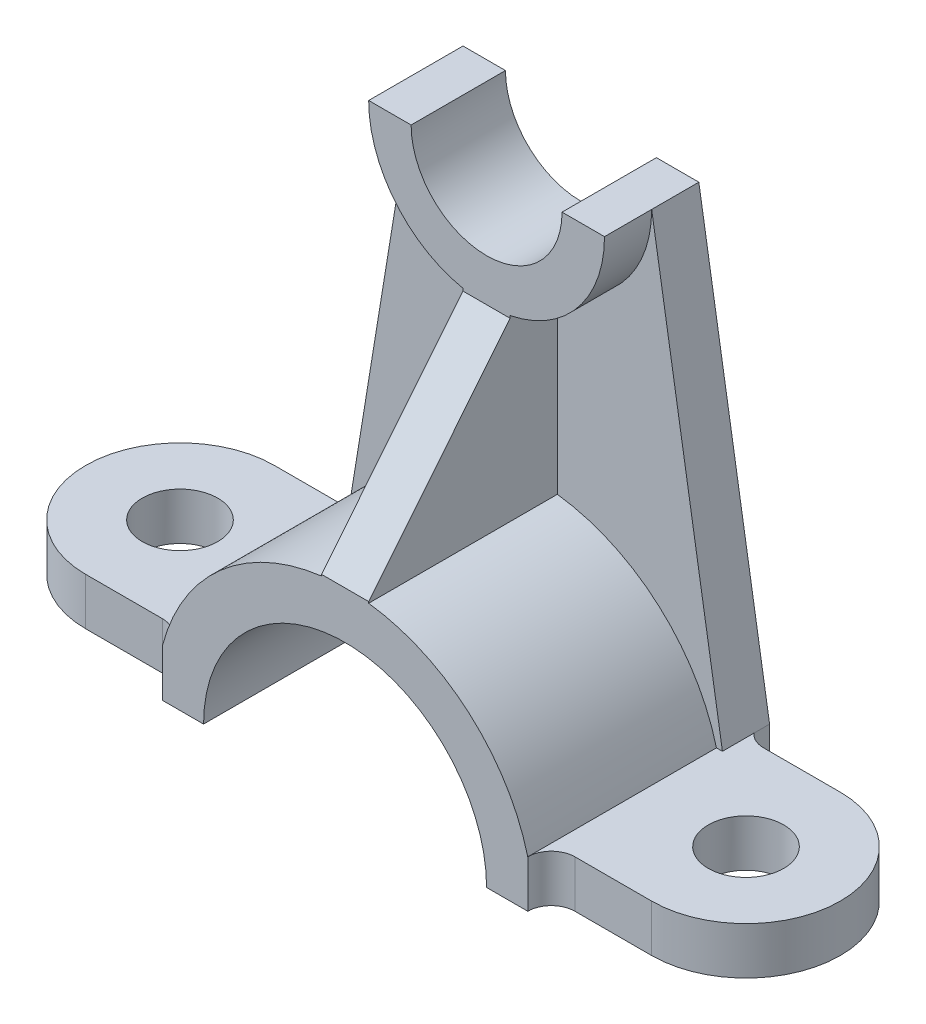
ISO-10303-21;
HEADER;
FILE_DESCRIPTION(('STEP AP214'),'2;1');
FILE_NAME('part.step','',(''),(''),'','','');
FILE_SCHEMA(('AUTOMOTIVE_DESIGN { 1 0 10303 214 1 1 1 1 }'));
ENDSEC;
DATA;
#1=APPLICATION_CONTEXT('core data for automotive mechanical design processes');
#2=APPLICATION_PROTOCOL_DEFINITION('international standard','automotive_design',2000,#1);
#3=PRODUCT_CONTEXT('',#1,'mechanical');
#4=PRODUCT('Part','Part','',(#3));
#5=PRODUCT_RELATED_PRODUCT_CATEGORY('part','',(#4));
#6=PRODUCT_DEFINITION_FORMATION('','',#4);
#7=PRODUCT_DEFINITION_CONTEXT('part definition',#1,'design');
#8=PRODUCT_DEFINITION('design','',#6,#7);
#9=PRODUCT_DEFINITION_SHAPE('','',#8);
#10=(LENGTH_UNIT() NAMED_UNIT(*) SI_UNIT(.MILLI.,.METRE.));
#11=(NAMED_UNIT(*) PLANE_ANGLE_UNIT() SI_UNIT($,.RADIAN.));
#12=(NAMED_UNIT(*) SI_UNIT($,.STERADIAN.) SOLID_ANGLE_UNIT());
#13=UNCERTAINTY_MEASURE_WITH_UNIT(LENGTH_MEASURE(1.E-05),#10,'distance_accuracy_value','');
#14=(GEOMETRIC_REPRESENTATION_CONTEXT(3) GLOBAL_UNCERTAINTY_ASSIGNED_CONTEXT((#13)) GLOBAL_UNIT_ASSIGNED_CONTEXT((#10,
#11,#12)) REPRESENTATION_CONTEXT('',''));
#15=CARTESIAN_POINT('',(0.,0.,0.));
#16=DIRECTION('',(0.,0.,1.));
#17=DIRECTION('',(1.,0.,0.));
#18=AXIS2_PLACEMENT_3D('',#15,#16,#17);
#19=CARTESIAN_POINT('',(-40.,102.,-40.));
#20=DIRECTION('',(0.,0.,-1.));
#21=DIRECTION('',(-1.,0.,0.));
#22=AXIS2_PLACEMENT_3D('',#19,#20,#21);
#23=PLANE('',#22);
#24=DIRECTION('',(0.,1.,0.));
#25=VECTOR('',#24,1.);
#26=CARTESIAN_POINT('',(5.,86.,-40.));
#27=LINE('',#26,#25);
#28=CARTESIAN_POINT('',(5.,39.6862696659689,-40.));
#29=VERTEX_POINT('',#28);
#30=CARTESIAN_POINT('',(5.,77.5051025721682,-40.));
#31=VERTEX_POINT('',#30);
#32=EDGE_CURVE('E241',#29,#31,#27,.T.);
#33=ORIENTED_EDGE('',*,*,#32,.F.);
#34=CARTESIAN_POINT('',(0.,0.,-40.));
#35=DIRECTION('',(0.,0.,1.));
#36=DIRECTION('',(1.,0.,0.));
#37=AXIS2_PLACEMENT_3D('',#34,#35,#36);
#38=CIRCLE('',#37,40.);
#39=CARTESIAN_POINT('',(38.7298334620742,10.,-40.));
#40=VERTEX_POINT('',#39);
#41=EDGE_CURVE('E445',#40,#29,#38,.T.);
#42=ORIENTED_EDGE('',*,*,#41,.F.);
#43=DIRECTION('',(-1.,0.,0.));
#44=VECTOR('',#43,1.);
#45=CARTESIAN_POINT('',(-40.001,10.,-40.));
#46=LINE('',#45,#44);
#47=CARTESIAN_POINT('',(40.,10.,-40.));
#48=VERTEX_POINT('',#47);
#49=EDGE_CURVE('E354',#48,#40,#46,.T.);
#50=ORIENTED_EDGE('',*,*,#49,.F.);
#51=DIRECTION('',(0.160918642578447,-0.98696767448114,0.));
#52=VECTOR('',#51,1.);
#53=CARTESIAN_POINT('',(40.,10.,-40.));
#54=LINE('',#53,#52);
#55=CARTESIAN_POINT('',(25.,102.,-40.));
#56=VERTEX_POINT('',#55);
#57=EDGE_CURVE('E285',#56,#48,#54,.T.);
#58=ORIENTED_EDGE('',*,*,#57,.F.);
#59=CARTESIAN_POINT('',(0.,102.,-40.));
#60=DIRECTION('',(0.,0.,1.));
#61=DIRECTION('',(1.,0.,0.));
#62=AXIS2_PLACEMENT_3D('',#59,#60,#61);
#63=CIRCLE('',#62,25.);
#64=EDGE_CURVE('E308',#31,#56,#63,.T.);
#65=ORIENTED_EDGE('',*,*,#64,.F.);
#66=EDGE_LOOP('',(#33,#42,#50,#58,#65));
#67=FACE_BOUND('',#66,.T.);
#68=ADVANCED_FACE('F33',(#67),#23,.F.);
#69=CARTESIAN_POINT('',(0.,0.,-40.));
#70=DIRECTION('',(0.,0.,1.));
#71=DIRECTION('',(1.,0.,0.));
#72=AXIS2_PLACEMENT_3D('',#69,#70,#71);
#73=CYLINDRICAL_SURFACE('',#72,40.);
#74=ORIENTED_EDGE('',*,*,#41,.T.);
#75=DIRECTION('',(0.,0.,1.));
#76=VECTOR('',#75,1.);
#77=CARTESIAN_POINT('',(5.,39.6862696659689,-40.));
#78=LINE('',#77,#76);
#79=CARTESIAN_POINT('',(5.,39.6862696659689,0.));
#80=VERTEX_POINT('',#79);
#81=EDGE_CURVE('E272',#29,#80,#78,.T.);
#82=ORIENTED_EDGE('',*,*,#81,.T.);
#83=CARTESIAN_POINT('',(0.,0.,0.));
#84=DIRECTION('',(0.,0.,1.));
#85=DIRECTION('',(1.,0.,0.));
#86=AXIS2_PLACEMENT_3D('',#83,#84,#85);
#87=CIRCLE('',#86,40.);
#88=CARTESIAN_POINT('',(38.7298334620742,10.,0.));
#89=VERTEX_POINT('',#88);
#90=EDGE_CURVE('E450',#89,#80,#87,.T.);
#91=ORIENTED_EDGE('',*,*,#90,.F.);
#92=DIRECTION('',(0.,0.,1.));
#93=VECTOR('',#92,1.);
#94=CARTESIAN_POINT('',(38.7298334620742,10.,-40.));
#95=LINE('',#94,#93);
#96=EDGE_CURVE('E427',#89,#40,#95,.F.);
#97=ORIENTED_EDGE('',*,*,#96,.T.);
#98=EDGE_LOOP('',(#74,#82,#91,#97));
#99=FACE_BOUND('',#98,.T.);
#100=ADVANCED_FACE('F533',(#99),#73,.T.);
#101=CARTESIAN_POINT('',(0.,102.,-30.));
#102=DIRECTION('',(0.,0.,-1.));
#103=DIRECTION('',(-1.,0.,0.));
#104=AXIS2_PLACEMENT_3D('',#101,#102,#103);
#105=CYLINDRICAL_SURFACE('',#104,25.);
#106=DIRECTION('',(0.,0.,-1.));
#107=VECTOR('',#106,1.);
#108=CARTESIAN_POINT('',(5.,77.5051025721682,-30.));
#109=LINE('',#108,#107);
#110=CARTESIAN_POINT('',(5.,77.5051025721682,-30.));
#111=VERTEX_POINT('',#110);
#112=EDGE_CURVE('E238',#31,#111,#109,.F.);
#113=ORIENTED_EDGE('',*,*,#112,.F.);
#114=ORIENTED_EDGE('',*,*,#64,.T.);
#115=DIRECTION('',(0.,0.,-1.));
#116=VECTOR('',#115,1.);
#117=CARTESIAN_POINT('',(25.,102.,-30.));
#118=LINE('',#117,#116);
#119=CARTESIAN_POINT('',(25.,102.,-30.));
#120=VERTEX_POINT('',#119);
#121=EDGE_CURVE('E323',#120,#56,#118,.T.);
#122=ORIENTED_EDGE('',*,*,#121,.F.);
#123=CARTESIAN_POINT('',(0.,102.,-30.));
#124=DIRECTION('',(0.,0.,1.));
#125=DIRECTION('',(1.,0.,0.));
#126=AXIS2_PLACEMENT_3D('',#123,#124,#125);
#127=CIRCLE('',#126,25.);
#128=EDGE_CURVE('E314',#111,#120,#127,.T.);
#129=ORIENTED_EDGE('',*,*,#128,.F.);
#130=EDGE_LOOP('',(#113,#114,#122,#129));
#131=FACE_BOUND('',#130,.T.);
#132=ADVANCED_FACE('F541',(#131),#105,.T.);
#133=CARTESIAN_POINT('',(0.,102.,0.));
#134=DIRECTION('',(0.,1.,0.));
#135=DIRECTION('',(0.,0.,1.));
#136=AXIS2_PLACEMENT_3D('',#133,#134,#135);
#137=PLANE('',#136);
#138=DIRECTION('',(0.,0.,1.));
#139=VECTOR('',#138,1.);
#140=CARTESIAN_POINT('',(-25.,102.,-50.));
#141=LINE('',#140,#139);
#142=CARTESIAN_POINT('',(-25.,102.,-50.));
#143=VERTEX_POINT('',#142);
#144=CARTESIAN_POINT('',(-25.,102.,-40.));
#145=VERTEX_POINT('',#144);
#146=EDGE_CURVE('E291',#143,#145,#141,.T.);
#147=ORIENTED_EDGE('',*,*,#146,.T.);
#148=DIRECTION('',(0.,0.,-1.));
#149=VECTOR('',#148,1.);
#150=CARTESIAN_POINT('',(-25.,102.,-30.));
#151=LINE('',#150,#149);
#152=CARTESIAN_POINT('',(-25.,102.,-30.));
#153=VERTEX_POINT('',#152);
#154=EDGE_CURVE('E326',#153,#145,#151,.T.);
#155=ORIENTED_EDGE('',*,*,#154,.F.);
#156=DIRECTION('',(-1.,0.,0.));
#157=VECTOR('',#156,1.);
#158=CARTESIAN_POINT('',(-25.,102.,-30.));
#159=LINE('',#158,#157);
#160=CARTESIAN_POINT('',(-16.,102.,-30.));
#161=VERTEX_POINT('',#160);
#162=EDGE_CURVE('E311',#161,#153,#159,.T.);
#163=ORIENTED_EDGE('',*,*,#162,.F.);
#164=DIRECTION('',(0.,0.,-1.));
#165=VECTOR('',#164,1.);
#166=CARTESIAN_POINT('',(-16.,102.,-30.));
#167=LINE('',#166,#165);
#168=CARTESIAN_POINT('',(-16.,102.,-50.));
#169=VERTEX_POINT('',#168);
#170=EDGE_CURVE('E329',#161,#169,#167,.T.);
#171=ORIENTED_EDGE('',*,*,#170,.T.);
#172=DIRECTION('',(-1.,0.,0.));
#173=VECTOR('',#172,1.);
#174=CARTESIAN_POINT('',(40.,102.,-50.));
#175=LINE('',#174,#173);
#176=EDGE_CURVE('E335',#169,#143,#175,.T.);
#177=ORIENTED_EDGE('',*,*,#176,.T.);
#178=EDGE_LOOP('',(#147,#155,#163,#171,#177));
#179=FACE_BOUND('',#178,.T.);
#180=ADVANCED_FACE('F503',(#179),#137,.T.);
#181=CARTESIAN_POINT('',(-5.,39.6862696659689,-40.));
#182=VERTEX_POINT('',#181);
#183=CARTESIAN_POINT('',(-38.7298334620742,10.,-40.));
#184=VERTEX_POINT('',#183);
#185=EDGE_CURVE('E449',#182,#184,#38,.T.);
#186=ORIENTED_EDGE('',*,*,#185,.F.);
#187=DIRECTION('',(0.,1.,0.));
#188=VECTOR('',#187,1.);
#189=CARTESIAN_POINT('',(-5.,86.,-40.));
#190=LINE('',#189,#188);
#191=CARTESIAN_POINT('',(-5.,77.5051025721682,-40.));
#192=VERTEX_POINT('',#191);
#193=EDGE_CURVE('E258',#182,#192,#190,.T.);
#194=ORIENTED_EDGE('',*,*,#193,.T.);
#195=EDGE_CURVE('E312',#145,#192,#63,.T.);
#196=ORIENTED_EDGE('',*,*,#195,.F.);
#197=DIRECTION('',(0.160918642578447,0.98696767448114,0.));
#198=VECTOR('',#197,1.);
#199=CARTESIAN_POINT('',(-40.,10.,-40.));
#200=LINE('',#199,#198);
#201=CARTESIAN_POINT('',(-40.,10.,-40.));
#202=VERTEX_POINT('',#201);
#203=EDGE_CURVE('E292',#202,#145,#200,.T.);
#204=ORIENTED_EDGE('',*,*,#203,.F.);
#205=DIRECTION('',(1.,0.,0.));
#206=VECTOR('',#205,1.);
#207=CARTESIAN_POINT('',(80.001,10.,-40.));
#208=LINE('',#207,#206);
#209=EDGE_CURVE('E356',#202,#184,#208,.T.);
#210=ORIENTED_EDGE('',*,*,#209,.T.);
#211=EDGE_LOOP('',(#186,#194,#196,#204,#210));
#212=FACE_BOUND('',#211,.T.);
#213=ADVANCED_FACE('F496',(#212),#23,.F.);
#214=CARTESIAN_POINT('',(30.,0.,-40.));
#215=DIRECTION('',(0.,-1.,0.));
#216=DIRECTION('',(0.,0.,-1.));
#217=AXIS2_PLACEMENT_3D('',#214,#215,#216);
#218=PLANE('',#217);
#219=CARTESIAN_POINT('',(-60.,0.,-25.));
#220=DIRECTION('',(0.,-1.,0.));
#221=DIRECTION('',(0.,0.,-1.));
#222=AXIS2_PLACEMENT_3D('',#219,#220,#221);
#223=CIRCLE('',#222,8.00000000000001);
#224=CARTESIAN_POINT('',(-60.,0.,-33.));
#225=VERTEX_POINT('',#224);
#226=EDGE_CURVE('E278',#225,#225,#223,.T.);
#227=ORIENTED_EDGE('',*,*,#226,.F.);
#228=EDGE_LOOP('',(#227));
#229=FACE_BOUND('',#228,.T.);
#230=DIRECTION('',(-1.,0.,0.));
#231=VECTOR('',#230,1.);
#232=CARTESIAN_POINT('',(40.,0.,-50.));
#233=LINE('',#232,#231);
#234=CARTESIAN_POINT('',(-30.,0.,-50.));
#235=VERTEX_POINT('',#234);
#236=CARTESIAN_POINT('',(-40.,0.,-50.));
#237=VERTEX_POINT('',#236);
#238=EDGE_CURVE('E345',#235,#237,#233,.T.);
#239=ORIENTED_EDGE('',*,*,#238,.F.);
#240=DIRECTION('',(0.,0.,1.));
#241=VECTOR('',#240,1.);
#242=CARTESIAN_POINT('',(-30.,0.,-40.));
#243=LINE('',#242,#241);
#244=CARTESIAN_POINT('',(-30.,0.,0.));
#245=VERTEX_POINT('',#244);
#246=EDGE_CURVE('E448',#235,#245,#243,.T.);
#247=ORIENTED_EDGE('',*,*,#246,.T.);
#248=DIRECTION('',(1.,0.,0.));
#249=VECTOR('',#248,1.);
#250=CARTESIAN_POINT('',(-40.,0.,0.));
#251=LINE('',#250,#249);
#252=CARTESIAN_POINT('',(-38.7298334620742,0.,0.));
#253=VERTEX_POINT('',#252);
#254=EDGE_CURVE('E453',#253,#245,#251,.T.);
#255=ORIENTED_EDGE('',*,*,#254,.F.);
#256=CARTESIAN_POINT('',(-43.7298334620742,0.,0.));
#257=DIRECTION('',(0.,-1.,0.));
#258=DIRECTION('',(0.,0.,1.));
#259=AXIS2_PLACEMENT_3D('',#256,#257,#258);
#260=CIRCLE('',#259,5.);
#261=CARTESIAN_POINT('',(-43.7298334620742,0.,-5.));
#262=VERTEX_POINT('',#261);
#263=EDGE_CURVE('E384',#253,#262,#260,.F.);
#264=ORIENTED_EDGE('',*,*,#263,.T.);
#265=DIRECTION('',(-1.,0.,0.));
#266=VECTOR('',#265,1.);
#267=CARTESIAN_POINT('',(0.,0.,-5.));
#268=LINE('',#267,#266);
#269=CARTESIAN_POINT('',(-60.,0.,-5.));
#270=VERTEX_POINT('',#269);
#271=EDGE_CURVE('E379',#262,#270,#268,.T.);
#272=ORIENTED_EDGE('',*,*,#271,.T.);
#273=CARTESIAN_POINT('',(-60.,0.,-25.));
#274=DIRECTION('',(0.,-1.,0.));
#275=DIRECTION('',(0.,0.,1.));
#276=AXIS2_PLACEMENT_3D('',#273,#274,#275);
#277=CIRCLE('',#276,20.);
#278=CARTESIAN_POINT('',(-60.,0.,-45.));
#279=VERTEX_POINT('',#278);
#280=EDGE_CURVE('E388',#270,#279,#277,.T.);
#281=ORIENTED_EDGE('',*,*,#280,.T.);
#282=DIRECTION('',(-1.,0.,0.));
#283=VECTOR('',#282,1.);
#284=CARTESIAN_POINT('',(0.,0.,-45.));
#285=LINE('',#284,#283);
#286=CARTESIAN_POINT('',(-43.7298334620742,0.,-45.));
#287=VERTEX_POINT('',#286);
#288=EDGE_CURVE('E364',#287,#279,#285,.T.);
#289=ORIENTED_EDGE('',*,*,#288,.F.);
#290=CARTESIAN_POINT('',(-43.7298334620742,0.,-50.));
#291=DIRECTION('',(0.,-1.,0.));
#292=DIRECTION('',(0.,0.,1.));
#293=AXIS2_PLACEMENT_3D('',#290,#291,#292);
#294=CIRCLE('',#293,5.);
#295=CARTESIAN_POINT('',(-40.,0.,-46.6700837330059));
#296=VERTEX_POINT('',#295);
#297=EDGE_CURVE('E362',#296,#287,#294,.T.);
#298=ORIENTED_EDGE('',*,*,#297,.F.);
#299=DIRECTION('',(0.,0.,1.));
#300=VECTOR('',#299,1.);
#301=CARTESIAN_POINT('',(-40.,0.,-50.));
#302=LINE('',#301,#300);
#303=EDGE_CURVE('E334',#237,#296,#302,.T.);
#304=ORIENTED_EDGE('',*,*,#303,.F.);
#305=EDGE_LOOP('',(#239,#247,#255,#264,#272,#281,#289,#298,#304));
#306=FACE_BOUND('',#305,.T.);
#307=ADVANCED_FACE('F479',(#229,#306),#218,.T.);
#308=CARTESIAN_POINT('',(80.001,10.,0.));
#309=DIRECTION('',(0.,-1.,0.));
#310=DIRECTION('',(0.,0.,-1.));
#311=AXIS2_PLACEMENT_3D('',#308,#309,#310);
#312=PLANE('',#311);
#313=CARTESIAN_POINT('',(-60.,10.,-25.));
#314=DIRECTION('',(0.,-1.,0.));
#315=DIRECTION('',(0.,0.,1.));
#316=AXIS2_PLACEMENT_3D('',#313,#314,#315);
#317=CIRCLE('',#316,8.00000000000001);
#318=CARTESIAN_POINT('',(-60.,10.,-17.));
#319=VERTEX_POINT('',#318);
#320=EDGE_CURVE('E275',#319,#319,#317,.T.);
#321=ORIENTED_EDGE('',*,*,#320,.T.);
#322=EDGE_LOOP('',(#321));
#323=FACE_BOUND('',#322,.T.);
#324=DIRECTION('',(0.,0.,1.));
#325=VECTOR('',#324,1.);
#326=CARTESIAN_POINT('',(-40.,10.,0.));
#327=LINE('',#326,#325);
#328=CARTESIAN_POINT('',(-40.,10.,-46.6700837330059));
#329=VERTEX_POINT('',#328);
#330=EDGE_CURVE('E352',#329,#202,#327,.T.);
#331=ORIENTED_EDGE('',*,*,#330,.F.);
#332=CARTESIAN_POINT('',(-43.7298334620742,10.,-50.));
#333=DIRECTION('',(0.,1.,0.));
#334=DIRECTION('',(0.,0.,1.));
#335=AXIS2_PLACEMENT_3D('',#332,#333,#334);
#336=CIRCLE('',#335,5.);
#337=CARTESIAN_POINT('',(-43.7298334620742,10.,-45.));
#338=VERTEX_POINT('',#337);
#339=EDGE_CURVE('E367',#329,#338,#336,.F.);
#340=ORIENTED_EDGE('',*,*,#339,.T.);
#341=DIRECTION('',(-1.,0.,0.));
#342=VECTOR('',#341,1.);
#343=CARTESIAN_POINT('',(0.,10.,-45.));
#344=LINE('',#343,#342);
#345=CARTESIAN_POINT('',(-60.,10.,-45.));
#346=VERTEX_POINT('',#345);
#347=EDGE_CURVE('E370',#338,#346,#344,.T.);
#348=ORIENTED_EDGE('',*,*,#347,.T.);
#349=CARTESIAN_POINT('',(-60.,10.,-25.));
#350=DIRECTION('',(0.,1.,0.));
#351=DIRECTION('',(0.,0.,1.));
#352=AXIS2_PLACEMENT_3D('',#349,#350,#351);
#353=CIRCLE('',#352,20.);
#354=CARTESIAN_POINT('',(-60.,10.,-5.));
#355=VERTEX_POINT('',#354);
#356=EDGE_CURVE('E393',#355,#346,#353,.F.);
#357=ORIENTED_EDGE('',*,*,#356,.F.);
#358=DIRECTION('',(-1.,0.,0.));
#359=VECTOR('',#358,1.);
#360=CARTESIAN_POINT('',(0.,10.,-5.));
#361=LINE('',#360,#359);
#362=CARTESIAN_POINT('',(-43.7298334620742,10.,-5.));
#363=VERTEX_POINT('',#362);
#364=EDGE_CURVE('E382',#363,#355,#361,.T.);
#365=ORIENTED_EDGE('',*,*,#364,.F.);
#366=CARTESIAN_POINT('',(-43.7298334620742,10.,0.));
#367=DIRECTION('',(0.,1.,0.));
#368=DIRECTION('',(0.,0.,1.));
#369=AXIS2_PLACEMENT_3D('',#366,#367,#368);
#370=CIRCLE('',#369,5.);
#371=CARTESIAN_POINT('',(-38.7298334620742,10.,0.));
#372=VERTEX_POINT('',#371);
#373=EDGE_CURVE('E390',#372,#363,#370,.T.);
#374=ORIENTED_EDGE('',*,*,#373,.F.);
#375=DIRECTION('',(0.,0.,1.));
#376=VECTOR('',#375,1.);
#377=CARTESIAN_POINT('',(-38.7298334620742,10.,-40.));
#378=LINE('',#377,#376);
#379=EDGE_CURVE('E392',#372,#184,#378,.F.);
#380=ORIENTED_EDGE('',*,*,#379,.T.);
#381=ORIENTED_EDGE('',*,*,#209,.F.);
#382=EDGE_LOOP('',(#331,#340,#348,#357,#365,#374,#380,#381));
#383=FACE_BOUND('',#382,.T.);
#384=ADVANCED_FACE('F487',(#323,#383),#312,.F.);
#385=CARTESIAN_POINT('',(-40.001,10.,0.));
#386=DIRECTION('',(0.,1.,0.));
#387=DIRECTION('',(0.,0.,1.));
#388=AXIS2_PLACEMENT_3D('',#385,#386,#387);
#389=PLANE('',#388);
#390=CARTESIAN_POINT('',(60.,10.,-25.));
#391=DIRECTION('',(0.,1.,0.));
#392=DIRECTION('',(0.,0.,1.));
#393=AXIS2_PLACEMENT_3D('',#390,#391,#392);
#394=CIRCLE('',#393,8.00000000000001);
#395=CARTESIAN_POINT('',(60.,10.,-17.));
#396=VERTEX_POINT('',#395);
#397=EDGE_CURVE('E282',#396,#396,#394,.T.);
#398=ORIENTED_EDGE('',*,*,#397,.F.);
#399=EDGE_LOOP('',(#398));
#400=FACE_BOUND('',#399,.T.);
#401=DIRECTION('',(0.,0.,1.));
#402=VECTOR('',#401,1.);
#403=CARTESIAN_POINT('',(40.,10.,0.));
#404=LINE('',#403,#402);
#405=CARTESIAN_POINT('',(40.,10.,-46.6700837330059));
#406=VERTEX_POINT('',#405);
#407=EDGE_CURVE('E359',#406,#48,#404,.T.);
#408=ORIENTED_EDGE('',*,*,#407,.T.);
#409=ORIENTED_EDGE('',*,*,#49,.T.);
#410=ORIENTED_EDGE('',*,*,#96,.F.);
#411=CARTESIAN_POINT('',(43.7298334620742,10.,0.));
#412=DIRECTION('',(0.,1.,0.));
#413=DIRECTION('',(0.,0.,1.));
#414=AXIS2_PLACEMENT_3D('',#411,#412,#413);
#415=CIRCLE('',#414,5.);
#416=CARTESIAN_POINT('',(43.7298334620742,10.,-5.));
#417=VERTEX_POINT('',#416);
#418=EDGE_CURVE('E430',#89,#417,#415,.F.);
#419=ORIENTED_EDGE('',*,*,#418,.T.);
#420=DIRECTION('',(1.,0.,0.));
#421=VECTOR('',#420,1.);
#422=CARTESIAN_POINT('',(0.,10.,-5.));
#423=LINE('',#422,#421);
#424=CARTESIAN_POINT('',(60.,10.,-5.));
#425=VERTEX_POINT('',#424);
#426=EDGE_CURVE('E435',#417,#425,#423,.T.);
#427=ORIENTED_EDGE('',*,*,#426,.T.);
#428=CARTESIAN_POINT('',(60.,10.,-25.));
#429=DIRECTION('',(0.,1.,0.));
#430=DIRECTION('',(0.,0.,1.));
#431=AXIS2_PLACEMENT_3D('',#428,#429,#430);
#432=CIRCLE('',#431,20.);
#433=CARTESIAN_POINT('',(60.,10.,-45.));
#434=VERTEX_POINT('',#433);
#435=EDGE_CURVE('E414',#425,#434,#432,.T.);
#436=ORIENTED_EDGE('',*,*,#435,.T.);
#437=DIRECTION('',(1.,0.,0.));
#438=VECTOR('',#437,1.);
#439=CARTESIAN_POINT('',(0.,10.,-45.));
#440=LINE('',#439,#438);
#441=CARTESIAN_POINT('',(43.7298334620742,10.,-45.));
#442=VERTEX_POINT('',#441);
#443=EDGE_CURVE('E411',#442,#434,#440,.T.);
#444=ORIENTED_EDGE('',*,*,#443,.F.);
#445=CARTESIAN_POINT('',(43.7298334620742,10.,-50.));
#446=DIRECTION('',(0.,1.,0.));
#447=DIRECTION('',(0.,0.,1.));
#448=AXIS2_PLACEMENT_3D('',#445,#446,#447);
#449=CIRCLE('',#448,5.);
#450=EDGE_CURVE('E415',#406,#442,#449,.T.);
#451=ORIENTED_EDGE('',*,*,#450,.F.);
#452=EDGE_LOOP('',(#408,#409,#410,#419,#427,#436,#444,#451));
#453=FACE_BOUND('',#452,.T.);
#454=ADVANCED_FACE('F567',(#400,#453),#389,.T.);
#455=CARTESIAN_POINT('',(43.7298334620742,58.2517009655425,-50.));
#456=DIRECTION('',(0.,-1.,0.));
#457=DIRECTION('',(0.,0.,-1.));
#458=AXIS2_PLACEMENT_3D('',#455,#456,#457);
#459=CYLINDRICAL_SURFACE('',#458,5.);
#460=CARTESIAN_POINT('',(43.7298334620742,0.,-50.));
#461=DIRECTION('',(0.,1.,0.));
#462=DIRECTION('',(0.,0.,1.));
#463=AXIS2_PLACEMENT_3D('',#460,#461,#462);
#464=CIRCLE('',#463,5.);
#465=CARTESIAN_POINT('',(40.,0.,-46.6700837330059));
#466=VERTEX_POINT('',#465);
#467=CARTESIAN_POINT('',(43.7298334620742,0.,-45.));
#468=VERTEX_POINT('',#467);
#469=EDGE_CURVE('E403',#466,#468,#464,.T.);
#470=ORIENTED_EDGE('',*,*,#469,.F.);
#471=DIRECTION('',(0.,-1.,0.));
#472=VECTOR('',#471,1.);
#473=CARTESIAN_POINT('',(40.,58.2517009655425,-46.6700837330059));
#474=LINE('',#473,#472);
#475=EDGE_CURVE('E11',#466,#406,#474,.F.);
#476=ORIENTED_EDGE('',*,*,#475,.T.);
#477=ORIENTED_EDGE('',*,*,#450,.T.);
#478=DIRECTION('',(0.,-1.,0.));
#479=VECTOR('',#478,1.);
#480=CARTESIAN_POINT('',(43.7298334620742,58.2517009655425,-45.));
#481=LINE('',#480,#479);
#482=EDGE_CURVE('E408',#442,#468,#481,.T.);
#483=ORIENTED_EDGE('',*,*,#482,.T.);
#484=EDGE_LOOP('',(#470,#476,#477,#483));
#485=FACE_BOUND('',#484,.T.);
#486=ADVANCED_FACE('F625',(#485),#459,.F.);
#487=CARTESIAN_POINT('',(-43.7298334620742,58.2517009655425,-50.));
#488=DIRECTION('',(0.,-1.,0.));
#489=DIRECTION('',(0.,0.,-1.));
#490=AXIS2_PLACEMENT_3D('',#487,#488,#489);
#491=CYLINDRICAL_SURFACE('',#490,5.);
#492=DIRECTION('',(0.,-1.,0.));
#493=VECTOR('',#492,1.);
#494=CARTESIAN_POINT('',(-40.,58.2517009655425,-46.6700837330059));
#495=LINE('',#494,#493);
#496=EDGE_CURVE('E41',#296,#329,#495,.F.);
#497=ORIENTED_EDGE('',*,*,#496,.F.);
#498=ORIENTED_EDGE('',*,*,#297,.T.);
#499=DIRECTION('',(0.,-1.,0.));
#500=VECTOR('',#499,1.);
#501=CARTESIAN_POINT('',(-43.7298334620742,58.2517009655425,-45.));
#502=LINE('',#501,#500);
#503=EDGE_CURVE('E369',#338,#287,#502,.T.);
#504=ORIENTED_EDGE('',*,*,#503,.F.);
#505=ORIENTED_EDGE('',*,*,#339,.F.);
#506=EDGE_LOOP('',(#497,#498,#504,#505));
#507=FACE_BOUND('',#506,.T.);
#508=ADVANCED_FACE('F473',(#507),#491,.F.);
#509=CARTESIAN_POINT('',(0.,0.,0.));
#510=DIRECTION('',(0.,0.,1.));
#511=DIRECTION('',(1.,0.,0.));
#512=AXIS2_PLACEMENT_3D('',#509,#510,#511);
#513=PLANE('',#512);
#514=CARTESIAN_POINT('',(0.,0.,0.));
#515=DIRECTION('',(0.,0.,-1.));
#516=DIRECTION('',(1.,0.,0.));
#517=AXIS2_PLACEMENT_3D('',#514,#515,#516);
#518=CIRCLE('',#517,30.);
#519=CARTESIAN_POINT('',(30.,0.,0.));
#520=VERTEX_POINT('',#519);
#521=EDGE_CURVE('E455',#245,#520,#518,.T.);
#522=ORIENTED_EDGE('',*,*,#521,.T.);
#523=DIRECTION('',(1.,0.,0.));
#524=VECTOR('',#523,1.);
#525=CARTESIAN_POINT('',(30.,0.,0.));
#526=LINE('',#525,#524);
#527=CARTESIAN_POINT('',(38.7298334620742,0.,0.));
#528=VERTEX_POINT('',#527);
#529=EDGE_CURVE('E457',#520,#528,#526,.T.);
#530=ORIENTED_EDGE('',*,*,#529,.T.);
#531=DIRECTION('',(0.,-1.,0.));
#532=VECTOR('',#531,1.);
#533=CARTESIAN_POINT('',(38.7298334620742,58.2517009655425,0.));
#534=LINE('',#533,#532);
#535=EDGE_CURVE('E429',#89,#528,#534,.T.);
#536=ORIENTED_EDGE('',*,*,#535,.F.);
#537=ORIENTED_EDGE('',*,*,#90,.T.);
#538=DIRECTION('',(0.,-1.,0.));
#539=VECTOR('',#538,1.);
#540=CARTESIAN_POINT('',(5.,30.,0.));
#541=LINE('',#540,#539);
#542=CARTESIAN_POINT('',(5.,40.,0.));
#543=VERTEX_POINT('',#542);
#544=EDGE_CURVE('E253',#543,#80,#541,.T.);
#545=ORIENTED_EDGE('',*,*,#544,.F.);
#546=DIRECTION('',(-1.,0.,0.));
#547=VECTOR('',#546,1.);
#548=CARTESIAN_POINT('',(5.,40.,0.));
#549=LINE('',#548,#547);
#550=CARTESIAN_POINT('',(-5.,40.,0.));
#551=VERTEX_POINT('',#550);
#552=EDGE_CURVE('E249',#543,#551,#549,.T.);
#553=ORIENTED_EDGE('',*,*,#552,.T.);
#554=DIRECTION('',(0.,-1.,0.));
#555=VECTOR('',#554,1.);
#556=CARTESIAN_POINT('',(-5.,30.,0.));
#557=LINE('',#556,#555);
#558=CARTESIAN_POINT('',(-5.,39.6862696659689,0.));
#559=VERTEX_POINT('',#558);
#560=EDGE_CURVE('E264',#551,#559,#557,.T.);
#561=ORIENTED_EDGE('',*,*,#560,.T.);
#562=EDGE_CURVE('E444',#559,#372,#87,.T.);
#563=ORIENTED_EDGE('',*,*,#562,.T.);
#564=DIRECTION('',(0.,-1.,0.));
#565=VECTOR('',#564,1.);
#566=CARTESIAN_POINT('',(-38.7298334620742,58.2517009655425,0.));
#567=LINE('',#566,#565);
#568=EDGE_CURVE('E387',#372,#253,#567,.T.);
#569=ORIENTED_EDGE('',*,*,#568,.T.);
#570=ORIENTED_EDGE('',*,*,#254,.T.);
#571=EDGE_LOOP('',(#522,#530,#536,#537,#545,#553,#561,#563,#569,#570));
#572=FACE_BOUND('',#571,.T.);
#573=ADVANCED_FACE('F517',(#572),#513,.T.);
#574=DIRECTION('',(0.,0.,1.));
#575=VECTOR('',#574,1.);
#576=CARTESIAN_POINT('',(-5.,39.6862696659689,-40.));
#577=LINE('',#576,#575);
#578=EDGE_CURVE('E269',#182,#559,#577,.T.);
#579=ORIENTED_EDGE('',*,*,#578,.F.);
#580=ORIENTED_EDGE('',*,*,#185,.T.);
#581=ORIENTED_EDGE('',*,*,#379,.F.);
#582=ORIENTED_EDGE('',*,*,#562,.F.);
#583=EDGE_LOOP('',(#579,#580,#581,#582));
#584=FACE_BOUND('',#583,.T.);
#585=ADVANCED_FACE('F35',(#584),#73,.T.);
#586=CARTESIAN_POINT('',(60.,0.,-25.));
#587=DIRECTION('',(0.,-1.,0.));
#588=DIRECTION('',(0.,0.,-1.));
#589=AXIS2_PLACEMENT_3D('',#586,#587,#588);
#590=CIRCLE('',#589,8.00000000000001);
#591=CARTESIAN_POINT('',(60.,0.,-33.));
#592=VERTEX_POINT('',#591);
#593=EDGE_CURVE('E281',#592,#592,#590,.F.);
#594=ORIENTED_EDGE('',*,*,#593,.T.);
#595=EDGE_LOOP('',(#594));
#596=FACE_BOUND('',#595,.T.);
#597=DIRECTION('',(0.,0.,1.));
#598=VECTOR('',#597,1.);
#599=CARTESIAN_POINT('',(30.,0.,-40.));
#600=LINE('',#599,#598);
#601=CARTESIAN_POINT('',(30.,0.,-50.));
#602=VERTEX_POINT('',#601);
#603=EDGE_CURVE('E460',#602,#520,#600,.T.);
#604=ORIENTED_EDGE('',*,*,#603,.F.);
#605=CARTESIAN_POINT('',(40.,0.,-50.));
#606=VERTEX_POINT('',#605);
#607=EDGE_CURVE('E339',#606,#602,#233,.T.);
#608=ORIENTED_EDGE('',*,*,#607,.F.);
#609=DIRECTION('',(0.,0.,-1.));
#610=VECTOR('',#609,1.);
#611=CARTESIAN_POINT('',(40.,0.,-40.));
#612=LINE('',#611,#610);
#613=EDGE_CURVE('E342',#466,#606,#612,.T.);
#614=ORIENTED_EDGE('',*,*,#613,.F.);
#615=ORIENTED_EDGE('',*,*,#469,.T.);
#616=DIRECTION('',(1.,0.,0.));
#617=VECTOR('',#616,1.);
#618=CARTESIAN_POINT('',(0.,0.,-45.));
#619=LINE('',#618,#617);
#620=CARTESIAN_POINT('',(60.,0.,-45.));
#621=VERTEX_POINT('',#620);
#622=EDGE_CURVE('E404',#468,#621,#619,.T.);
#623=ORIENTED_EDGE('',*,*,#622,.T.);
#624=CARTESIAN_POINT('',(60.,0.,-25.));
#625=DIRECTION('',(0.,1.,0.));
#626=DIRECTION('',(0.,0.,1.));
#627=AXIS2_PLACEMENT_3D('',#624,#625,#626);
#628=CIRCLE('',#627,20.);
#629=CARTESIAN_POINT('',(60.,0.,-5.));
#630=VERTEX_POINT('',#629);
#631=EDGE_CURVE('E424',#630,#621,#628,.T.);
#632=ORIENTED_EDGE('',*,*,#631,.F.);
#633=DIRECTION('',(1.,0.,0.));
#634=VECTOR('',#633,1.);
#635=CARTESIAN_POINT('',(0.,0.,-5.));
#636=LINE('',#635,#634);
#637=CARTESIAN_POINT('',(43.7298334620742,0.,-5.));
#638=VERTEX_POINT('',#637);
#639=EDGE_CURVE('E423',#638,#630,#636,.T.);
#640=ORIENTED_EDGE('',*,*,#639,.F.);
#641=CARTESIAN_POINT('',(43.7298334620742,0.,0.));
#642=DIRECTION('',(0.,1.,0.));
#643=DIRECTION('',(0.,0.,1.));
#644=AXIS2_PLACEMENT_3D('',#641,#642,#643);
#645=CIRCLE('',#644,5.);
#646=EDGE_CURVE('E420',#528,#638,#645,.F.);
#647=ORIENTED_EDGE('',*,*,#646,.F.);
#648=ORIENTED_EDGE('',*,*,#529,.F.);
#649=EDGE_LOOP('',(#604,#608,#614,#615,#623,#632,#640,#647,#648));
#650=FACE_BOUND('',#649,.T.);
#651=ADVANCED_FACE('F559',(#596,#650),#218,.T.);
#652=CARTESIAN_POINT('',(0.,0.,-40.));
#653=DIRECTION('',(0.,0.,1.));
#654=DIRECTION('',(1.,0.,0.));
#655=AXIS2_PLACEMENT_3D('',#652,#653,#654);
#656=CYLINDRICAL_SURFACE('',#655,30.);
#657=ORIENTED_EDGE('',*,*,#603,.T.);
#658=ORIENTED_EDGE('',*,*,#521,.F.);
#659=ORIENTED_EDGE('',*,*,#246,.F.);
#660=CARTESIAN_POINT('',(0.,0.,-50.));
#661=DIRECTION('',(0.,0.,-1.));
#662=DIRECTION('',(-1.,0.,0.));
#663=AXIS2_PLACEMENT_3D('',#660,#661,#662);
#664=CIRCLE('',#663,30.);
#665=EDGE_CURVE('E331',#235,#602,#664,.T.);
#666=ORIENTED_EDGE('',*,*,#665,.T.);
#667=EDGE_LOOP('',(#657,#658,#659,#666));
#668=FACE_BOUND('',#667,.T.);
#669=ADVANCED_FACE('F514',(#668),#656,.F.);
#670=CARTESIAN_POINT('',(60.,58.2517009655425,-25.));
#671=DIRECTION('',(0.,-1.,0.));
#672=DIRECTION('',(0.,0.,-1.));
#673=AXIS2_PLACEMENT_3D('',#670,#671,#672);
#674=CYLINDRICAL_SURFACE('',#673,20.);
#675=DIRECTION('',(0.,-1.,0.));
#676=VECTOR('',#675,1.);
#677=CARTESIAN_POINT('',(60.,58.2517009655425,-5.));
#678=LINE('',#677,#676);
#679=EDGE_CURVE('E434',#425,#630,#678,.T.);
#680=ORIENTED_EDGE('',*,*,#679,.T.);
#681=ORIENTED_EDGE('',*,*,#631,.T.);
#682=DIRECTION('',(0.,-1.,0.));
#683=VECTOR('',#682,1.);
#684=CARTESIAN_POINT('',(60.,58.2517009655425,-45.));
#685=LINE('',#684,#683);
#686=EDGE_CURVE('E407',#434,#621,#685,.T.);
#687=ORIENTED_EDGE('',*,*,#686,.F.);
#688=ORIENTED_EDGE('',*,*,#435,.F.);
#689=EDGE_LOOP('',(#680,#681,#687,#688));
#690=FACE_BOUND('',#689,.T.);
#691=ADVANCED_FACE('F650',(#690),#674,.T.);
#692=CARTESIAN_POINT('',(0.,58.2517009655425,-5.));
#693=DIRECTION('',(0.,0.,-1.));
#694=DIRECTION('',(-1.,0.,0.));
#695=AXIS2_PLACEMENT_3D('',#692,#693,#694);
#696=PLANE('',#695);
#697=DIRECTION('',(0.,-1.,0.));
#698=VECTOR('',#697,1.);
#699=CARTESIAN_POINT('',(43.7298334620742,58.2517009655425,-5.));
#700=LINE('',#699,#698);
#701=EDGE_CURVE('E433',#417,#638,#700,.T.);
#702=ORIENTED_EDGE('',*,*,#701,.T.);
#703=ORIENTED_EDGE('',*,*,#639,.T.);
#704=ORIENTED_EDGE('',*,*,#679,.F.);
#705=ORIENTED_EDGE('',*,*,#426,.F.);
#706=EDGE_LOOP('',(#702,#703,#704,#705));
#707=FACE_BOUND('',#706,.T.);
#708=ADVANCED_FACE('F647',(#707),#696,.F.);
#709=CARTESIAN_POINT('',(43.7298334620742,58.2517009655425,0.));
#710=DIRECTION('',(0.,-1.,0.));
#711=DIRECTION('',(0.,0.,-1.));
#712=AXIS2_PLACEMENT_3D('',#709,#710,#711);
#713=CYLINDRICAL_SURFACE('',#712,5.);
#714=ORIENTED_EDGE('',*,*,#535,.T.);
#715=ORIENTED_EDGE('',*,*,#646,.T.);
#716=ORIENTED_EDGE('',*,*,#701,.F.);
#717=ORIENTED_EDGE('',*,*,#418,.F.);
#718=EDGE_LOOP('',(#714,#715,#716,#717));
#719=FACE_BOUND('',#718,.T.);
#720=ADVANCED_FACE('F564',(#719),#713,.F.);
#721=CARTESIAN_POINT('',(0.,58.2517009655425,-45.));
#722=DIRECTION('',(0.,0.,-1.));
#723=DIRECTION('',(-1.,0.,0.));
#724=AXIS2_PLACEMENT_3D('',#721,#722,#723);
#725=PLANE('',#724);
#726=ORIENTED_EDGE('',*,*,#443,.T.);
#727=ORIENTED_EDGE('',*,*,#686,.T.);
#728=ORIENTED_EDGE('',*,*,#622,.F.);
#729=ORIENTED_EDGE('',*,*,#482,.F.);
#730=EDGE_LOOP('',(#726,#727,#728,#729));
#731=FACE_BOUND('',#730,.T.);
#732=ADVANCED_FACE('F634',(#731),#725,.T.);
#733=CARTESIAN_POINT('',(-60.,58.2517009655425,-25.));
#734=DIRECTION('',(0.,-1.,0.));
#735=DIRECTION('',(0.,0.,-1.));
#736=AXIS2_PLACEMENT_3D('',#733,#734,#735);
#737=CYLINDRICAL_SURFACE('',#736,20.);
#738=ORIENTED_EDGE('',*,*,#356,.T.);
#739=DIRECTION('',(0.,-1.,0.));
#740=VECTOR('',#739,1.);
#741=CARTESIAN_POINT('',(-60.,58.2517009655425,-45.));
#742=LINE('',#741,#740);
#743=EDGE_CURVE('E373',#346,#279,#742,.T.);
#744=ORIENTED_EDGE('',*,*,#743,.T.);
#745=ORIENTED_EDGE('',*,*,#280,.F.);
#746=DIRECTION('',(0.,-1.,0.));
#747=VECTOR('',#746,1.);
#748=CARTESIAN_POINT('',(-60.,58.2517009655425,-5.));
#749=LINE('',#748,#747);
#750=EDGE_CURVE('E376',#355,#270,#749,.T.);
#751=ORIENTED_EDGE('',*,*,#750,.F.);
#752=EDGE_LOOP('',(#738,#744,#745,#751));
#753=FACE_BOUND('',#752,.T.);
#754=ADVANCED_FACE('F631',(#753),#737,.T.);
#755=CARTESIAN_POINT('',(-43.7298334620742,58.2517009655425,0.));
#756=DIRECTION('',(0.,-1.,0.));
#757=DIRECTION('',(0.,0.,-1.));
#758=AXIS2_PLACEMENT_3D('',#755,#756,#757);
#759=CYLINDRICAL_SURFACE('',#758,5.);
#760=ORIENTED_EDGE('',*,*,#373,.T.);
#761=DIRECTION('',(0.,-1.,0.));
#762=VECTOR('',#761,1.);
#763=CARTESIAN_POINT('',(-43.7298334620742,58.2517009655425,-5.));
#764=LINE('',#763,#762);
#765=EDGE_CURVE('E383',#363,#262,#764,.T.);
#766=ORIENTED_EDGE('',*,*,#765,.T.);
#767=ORIENTED_EDGE('',*,*,#263,.F.);
#768=ORIENTED_EDGE('',*,*,#568,.F.);
#769=EDGE_LOOP('',(#760,#766,#767,#768));
#770=FACE_BOUND('',#769,.T.);
#771=ADVANCED_FACE('F523',(#770),#759,.F.);
#772=CARTESIAN_POINT('',(0.,58.2517009655425,-5.));
#773=DIRECTION('',(0.,0.,1.));
#774=DIRECTION('',(1.,0.,0.));
#775=AXIS2_PLACEMENT_3D('',#772,#773,#774);
#776=PLANE('',#775);
#777=ORIENTED_EDGE('',*,*,#364,.T.);
#778=ORIENTED_EDGE('',*,*,#750,.T.);
#779=ORIENTED_EDGE('',*,*,#271,.F.);
#780=ORIENTED_EDGE('',*,*,#765,.F.);
#781=EDGE_LOOP('',(#777,#778,#779,#780));
#782=FACE_BOUND('',#781,.T.);
#783=ADVANCED_FACE('F620',(#782),#776,.T.);
#784=CARTESIAN_POINT('',(0.,58.2517009655425,-45.));
#785=DIRECTION('',(0.,0.,1.));
#786=DIRECTION('',(1.,0.,0.));
#787=AXIS2_PLACEMENT_3D('',#784,#785,#786);
#788=PLANE('',#787);
#789=ORIENTED_EDGE('',*,*,#503,.T.);
#790=ORIENTED_EDGE('',*,*,#288,.T.);
#791=ORIENTED_EDGE('',*,*,#743,.F.);
#792=ORIENTED_EDGE('',*,*,#347,.F.);
#793=EDGE_LOOP('',(#789,#790,#791,#792));
#794=FACE_BOUND('',#793,.T.);
#795=ADVANCED_FACE('F483',(#794),#788,.F.);
#796=CARTESIAN_POINT('',(-40.,102.,-50.));
#797=DIRECTION('',(1.,0.,0.));
#798=DIRECTION('',(0.,0.,-1.));
#799=AXIS2_PLACEMENT_3D('',#796,#797,#798);
#800=PLANE('',#799);
#801=ORIENTED_EDGE('',*,*,#496,.T.);
#802=DIRECTION('',(0.,0.,1.));
#803=VECTOR('',#802,1.);
#804=CARTESIAN_POINT('',(-40.,10.,-50.));
#805=LINE('',#804,#803);
#806=CARTESIAN_POINT('',(-40.,10.,-50.));
#807=VERTEX_POINT('',#806);
#808=EDGE_CURVE('E295',#807,#329,#805,.T.);
#809=ORIENTED_EDGE('',*,*,#808,.F.);
#810=DIRECTION('',(0.,-1.,0.));
#811=VECTOR('',#810,1.);
#812=CARTESIAN_POINT('',(-40.,102.,-50.));
#813=LINE('',#812,#811);
#814=EDGE_CURVE('E348',#807,#237,#813,.T.);
#815=ORIENTED_EDGE('',*,*,#814,.T.);
#816=ORIENTED_EDGE('',*,*,#303,.T.);
#817=EDGE_LOOP('',(#801,#809,#815,#816));
#818=FACE_BOUND('',#817,.T.);
#819=ADVANCED_FACE('F467',(#818),#800,.F.);
#820=CARTESIAN_POINT('',(40.,102.,-40.));
#821=DIRECTION('',(-1.,0.,0.));
#822=DIRECTION('',(0.,0.,1.));
#823=AXIS2_PLACEMENT_3D('',#820,#821,#822);
#824=PLANE('',#823);
#825=DIRECTION('',(0.,-1.,0.));
#826=VECTOR('',#825,1.);
#827=CARTESIAN_POINT('',(40.,102.,-50.));
#828=LINE('',#827,#826);
#829=CARTESIAN_POINT('',(40.,10.,-50.));
#830=VERTEX_POINT('',#829);
#831=EDGE_CURVE('E350',#830,#606,#828,.T.);
#832=ORIENTED_EDGE('',*,*,#831,.F.);
#833=DIRECTION('',(0.,0.,1.));
#834=VECTOR('',#833,1.);
#835=CARTESIAN_POINT('',(40.,10.,-50.));
#836=LINE('',#835,#834);
#837=EDGE_CURVE('E301',#830,#406,#836,.T.);
#838=ORIENTED_EDGE('',*,*,#837,.T.);
#839=ORIENTED_EDGE('',*,*,#475,.F.);
#840=ORIENTED_EDGE('',*,*,#613,.T.);
#841=EDGE_LOOP('',(#832,#838,#839,#840));
#842=FACE_BOUND('',#841,.T.);
#843=ADVANCED_FACE('F554',(#842),#824,.F.);
#844=CARTESIAN_POINT('',(40.,102.,-50.));
#845=DIRECTION('',(0.,0.,1.));
#846=DIRECTION('',(1.,0.,0.));
#847=AXIS2_PLACEMENT_3D('',#844,#845,#846);
#848=PLANE('',#847);
#849=CARTESIAN_POINT('',(38.7298334620742,10.,-50.));
#850=VERTEX_POINT('',#849);
#851=VERTEX_LOOP('',#850);
#852=FACE_BOUND('',#851,.T.);
#853=CARTESIAN_POINT('',(-38.7298334620742,10.,-50.));
#854=VERTEX_POINT('',#853);
#855=VERTEX_LOOP('',#854);
#856=FACE_BOUND('',#855,.T.);
#857=CARTESIAN_POINT('',(25.,102.,-50.));
#858=VERTEX_POINT('',#857);
#859=CARTESIAN_POINT('',(16.,102.,-50.));
#860=VERTEX_POINT('',#859);
#861=EDGE_CURVE('E338',#858,#860,#175,.T.);
#862=ORIENTED_EDGE('',*,*,#861,.F.);
#863=DIRECTION('',(0.160918642578447,-0.98696767448114,0.));
#864=VECTOR('',#863,1.);
#865=CARTESIAN_POINT('',(40.,10.,-50.));
#866=LINE('',#865,#864);
#867=EDGE_CURVE('E56',#858,#830,#866,.T.);
#868=ORIENTED_EDGE('',*,*,#867,.T.);
#869=ORIENTED_EDGE('',*,*,#831,.T.);
#870=ORIENTED_EDGE('',*,*,#607,.T.);
#871=ORIENTED_EDGE('',*,*,#665,.F.);
#872=ORIENTED_EDGE('',*,*,#238,.T.);
#873=ORIENTED_EDGE('',*,*,#814,.F.);
#874=DIRECTION('',(0.160918642578447,0.98696767448114,0.));
#875=VECTOR('',#874,1.);
#876=CARTESIAN_POINT('',(-40.,10.,-50.));
#877=LINE('',#876,#875);
#878=EDGE_CURVE('E288',#807,#143,#877,.T.);
#879=ORIENTED_EDGE('',*,*,#878,.T.);
#880=ORIENTED_EDGE('',*,*,#176,.F.);
#881=CARTESIAN_POINT('',(0.,102.,-50.));
#882=DIRECTION('',(0.,0.,1.));
#883=DIRECTION('',(1.,0.,0.));
#884=AXIS2_PLACEMENT_3D('',#881,#882,#883);
#885=CIRCLE('',#884,16.);
#886=EDGE_CURVE('E297',#169,#860,#885,.T.);
#887=ORIENTED_EDGE('',*,*,#886,.T.);
#888=EDGE_LOOP('',(#862,#868,#869,#870,#871,#872,#873,#879,#880,#887));
#889=FACE_BOUND('',#888,.T.);
#890=ADVANCED_FACE('F508',(#852,#856,#889),#848,.F.);
#891=DIRECTION('',(0.,0.,1.));
#892=VECTOR('',#891,1.);
#893=CARTESIAN_POINT('',(25.,102.,-50.));
#894=LINE('',#893,#892);
#895=EDGE_CURVE('E294',#858,#56,#894,.T.);
#896=ORIENTED_EDGE('',*,*,#895,.F.);
#897=ORIENTED_EDGE('',*,*,#861,.T.);
#898=DIRECTION('',(0.,0.,-1.));
#899=VECTOR('',#898,1.);
#900=CARTESIAN_POINT('',(16.,102.,-30.));
#901=LINE('',#900,#899);
#902=CARTESIAN_POINT('',(16.,102.,-30.));
#903=VERTEX_POINT('',#902);
#904=EDGE_CURVE('E319',#903,#860,#901,.T.);
#905=ORIENTED_EDGE('',*,*,#904,.F.);
#906=DIRECTION('',(-1.,0.,0.));
#907=VECTOR('',#906,1.);
#908=CARTESIAN_POINT('',(16.,102.,-30.));
#909=LINE('',#908,#907);
#910=EDGE_CURVE('E317',#120,#903,#909,.T.);
#911=ORIENTED_EDGE('',*,*,#910,.F.);
#912=ORIENTED_EDGE('',*,*,#121,.T.);
#913=EDGE_LOOP('',(#896,#897,#905,#911,#912));
#914=FACE_BOUND('',#913,.T.);
#915=ADVANCED_FACE('F548',(#914),#137,.T.);
#916=CARTESIAN_POINT('',(0.,102.,-30.));
#917=DIRECTION('',(0.,0.,-1.));
#918=DIRECTION('',(-1.,0.,0.));
#919=AXIS2_PLACEMENT_3D('',#916,#917,#918);
#920=CYLINDRICAL_SURFACE('',#919,16.);
#921=ORIENTED_EDGE('',*,*,#170,.F.);
#922=CARTESIAN_POINT('',(0.,102.,-30.));
#923=DIRECTION('',(0.,0.,-1.));
#924=DIRECTION('',(1.,0.,0.));
#925=AXIS2_PLACEMENT_3D('',#922,#923,#924);
#926=CIRCLE('',#925,16.);
#927=EDGE_CURVE('E309',#903,#161,#926,.T.);
#928=ORIENTED_EDGE('',*,*,#927,.F.);
#929=ORIENTED_EDGE('',*,*,#904,.T.);
#930=ORIENTED_EDGE('',*,*,#886,.F.);
#931=EDGE_LOOP('',(#921,#928,#929,#930));
#932=FACE_BOUND('',#931,.T.);
#933=ADVANCED_FACE('F551',(#932),#920,.F.);
#934=ORIENTED_EDGE('',*,*,#195,.T.);
#935=DIRECTION('',(0.,0.,-1.));
#936=VECTOR('',#935,1.);
#937=CARTESIAN_POINT('',(-5.,77.5051025721682,-30.));
#938=LINE('',#937,#936);
#939=CARTESIAN_POINT('',(-5.,77.5051025721682,-30.));
#940=VERTEX_POINT('',#939);
#941=EDGE_CURVE('E248',#192,#940,#938,.F.);
#942=ORIENTED_EDGE('',*,*,#941,.T.);
#943=EDGE_CURVE('E315',#153,#940,#127,.T.);
#944=ORIENTED_EDGE('',*,*,#943,.F.);
#945=ORIENTED_EDGE('',*,*,#154,.T.);
#946=EDGE_LOOP('',(#934,#942,#944,#945));
#947=FACE_BOUND('',#946,.T.);
#948=ADVANCED_FACE('F498',(#947),#105,.T.);
#949=CARTESIAN_POINT('',(0.,102.,-30.));
#950=DIRECTION('',(0.,0.,1.));
#951=DIRECTION('',(1.,0.,0.));
#952=AXIS2_PLACEMENT_3D('',#949,#950,#951);
#953=PLANE('',#952);
#954=ORIENTED_EDGE('',*,*,#927,.T.);
#955=ORIENTED_EDGE('',*,*,#162,.T.);
#956=ORIENTED_EDGE('',*,*,#943,.T.);
#957=DIRECTION('',(0.,-1.,0.));
#958=VECTOR('',#957,1.);
#959=CARTESIAN_POINT('',(-5.,77.,-30.));
#960=LINE('',#959,#958);
#961=CARTESIAN_POINT('',(-5.,77.,-30.));
#962=VERTEX_POINT('',#961);
#963=EDGE_CURVE('E48',#940,#962,#960,.T.);
#964=ORIENTED_EDGE('',*,*,#963,.T.);
#965=DIRECTION('',(-1.,0.,0.));
#966=VECTOR('',#965,1.);
#967=CARTESIAN_POINT('',(5.,77.,-30.));
#968=LINE('',#967,#966);
#969=CARTESIAN_POINT('',(5.,77.,-30.));
#970=VERTEX_POINT('',#969);
#971=EDGE_CURVE('E243',#970,#962,#968,.T.);
#972=ORIENTED_EDGE('',*,*,#971,.F.);
#973=DIRECTION('',(0.,-1.,0.));
#974=VECTOR('',#973,1.);
#975=CARTESIAN_POINT('',(5.,77.,-30.));
#976=LINE('',#975,#974);
#977=EDGE_CURVE('E231',#111,#970,#976,.T.);
#978=ORIENTED_EDGE('',*,*,#977,.F.);
#979=ORIENTED_EDGE('',*,*,#128,.T.);
#980=ORIENTED_EDGE('',*,*,#910,.T.);
#981=EDGE_LOOP('',(#954,#955,#956,#964,#972,#978,#979,#980));
#982=FACE_BOUND('',#981,.T.);
#983=ADVANCED_FACE('F244',(#982),#953,.T.);
#984=CARTESIAN_POINT('',(-40.,10.,-50.));
#985=DIRECTION('',(0.98696767448114,-0.160918642578447,0.));
#986=DIRECTION('',(0.160918642578447,0.98696767448114,0.));
#987=AXIS2_PLACEMENT_3D('',#984,#985,#986);
#988=PLANE('',#987);
#989=ORIENTED_EDGE('',*,*,#203,.T.);
#990=ORIENTED_EDGE('',*,*,#146,.F.);
#991=ORIENTED_EDGE('',*,*,#878,.F.);
#992=ORIENTED_EDGE('',*,*,#808,.T.);
#993=ORIENTED_EDGE('',*,*,#330,.T.);
#994=EDGE_LOOP('',(#989,#990,#991,#992,#993));
#995=FACE_BOUND('',#994,.T.);
#996=ADVANCED_FACE('F492',(#995),#988,.F.);
#997=CARTESIAN_POINT('',(40.,10.,-50.));
#998=DIRECTION('',(-0.98696767448114,-0.160918642578447,0.));
#999=DIRECTION('',(0.160918642578447,-0.98696767448114,0.));
#1000=AXIS2_PLACEMENT_3D('',#997,#998,#999);
#1001=PLANE('',#1000);
#1002=ORIENTED_EDGE('',*,*,#57,.T.);
#1003=ORIENTED_EDGE('',*,*,#407,.F.);
#1004=ORIENTED_EDGE('',*,*,#837,.F.);
#1005=ORIENTED_EDGE('',*,*,#867,.F.);
#1006=ORIENTED_EDGE('',*,*,#895,.T.);
#1007=EDGE_LOOP('',(#1002,#1003,#1004,#1005,#1006));
#1008=FACE_BOUND('',#1007,.T.);
#1009=ADVANCED_FACE('F570',(#1008),#1001,.F.);
#1010=CARTESIAN_POINT('',(60.,-0.000999999999999265,-25.));
#1011=DIRECTION('',(0.,1.,0.));
#1012=DIRECTION('',(0.,0.,1.));
#1013=AXIS2_PLACEMENT_3D('',#1010,#1011,#1012);
#1014=CYLINDRICAL_SURFACE('',#1013,8.00000000000001);
#1015=ORIENTED_EDGE('',*,*,#593,.F.);
#1016=EDGE_LOOP('',(#1015));
#1017=FACE_BOUND('',#1016,.T.);
#1018=ORIENTED_EDGE('',*,*,#397,.T.);
#1019=EDGE_LOOP('',(#1018));
#1020=FACE_BOUND('',#1019,.T.);
#1021=ADVANCED_FACE('F572',(#1017,#1020),#1014,.F.);
#1022=CARTESIAN_POINT('',(-60.,-0.000999999999999265,-25.));
#1023=DIRECTION('',(0.,1.,0.));
#1024=DIRECTION('',(0.,0.,1.));
#1025=AXIS2_PLACEMENT_3D('',#1022,#1023,#1024);
#1026=CYLINDRICAL_SURFACE('',#1025,8.00000000000001);
#1027=ORIENTED_EDGE('',*,*,#226,.T.);
#1028=EDGE_LOOP('',(#1027));
#1029=FACE_BOUND('',#1028,.T.);
#1030=ORIENTED_EDGE('',*,*,#320,.F.);
#1031=EDGE_LOOP('',(#1030));
#1032=FACE_BOUND('',#1031,.T.);
#1033=ADVANCED_FACE('F578',(#1029,#1032),#1026,.F.);
#1034=CARTESIAN_POINT('',(5.,0.,0.));
#1035=DIRECTION('',(-1.,0.,0.));
#1036=DIRECTION('',(0.,0.,1.));
#1037=AXIS2_PLACEMENT_3D('',#1034,#1035,#1036);
#1038=PLANE('',#1037);
#1039=ORIENTED_EDGE('',*,*,#81,.F.);
#1040=ORIENTED_EDGE('',*,*,#32,.T.);
#1041=ORIENTED_EDGE('',*,*,#112,.T.);
#1042=ORIENTED_EDGE('',*,*,#977,.T.);
#1043=DIRECTION('',(0.,-0.776755748719504,0.629801958421219));
#1044=VECTOR('',#1043,1.);
#1045=CARTESIAN_POINT('',(5.,40.,0.));
#1046=LINE('',#1045,#1044);
#1047=EDGE_CURVE('E235',#970,#543,#1046,.T.);
#1048=ORIENTED_EDGE('',*,*,#1047,.T.);
#1049=ORIENTED_EDGE('',*,*,#544,.T.);
#1050=EDGE_LOOP('',(#1039,#1040,#1041,#1042,#1048,#1049));
#1051=FACE_BOUND('',#1050,.T.);
#1052=ADVANCED_FACE('F233',(#1051),#1038,.F.);
#1053=CARTESIAN_POINT('',(-5.,0.,0.));
#1054=DIRECTION('',(-1.,0.,0.));
#1055=DIRECTION('',(0.,0.,1.));
#1056=AXIS2_PLACEMENT_3D('',#1053,#1054,#1055);
#1057=PLANE('',#1056);
#1058=ORIENTED_EDGE('',*,*,#193,.F.);
#1059=ORIENTED_EDGE('',*,*,#578,.T.);
#1060=ORIENTED_EDGE('',*,*,#560,.F.);
#1061=DIRECTION('',(0.,-0.776755748719504,0.629801958421219));
#1062=VECTOR('',#1061,1.);
#1063=CARTESIAN_POINT('',(-5.,40.,0.));
#1064=LINE('',#1063,#1062);
#1065=EDGE_CURVE('E262',#962,#551,#1064,.T.);
#1066=ORIENTED_EDGE('',*,*,#1065,.F.);
#1067=ORIENTED_EDGE('',*,*,#963,.F.);
#1068=ORIENTED_EDGE('',*,*,#941,.F.);
#1069=EDGE_LOOP('',(#1058,#1059,#1060,#1066,#1067,#1068));
#1070=FACE_BOUND('',#1069,.T.);
#1071=ADVANCED_FACE('F529',(#1070),#1057,.T.);
#1072=CARTESIAN_POINT('',(5.,40.,0.));
#1073=DIRECTION('',(0.,-0.629801958421219,-0.776755748719504));
#1074=DIRECTION('',(0.,0.776755748719504,-0.629801958421219));
#1075=AXIS2_PLACEMENT_3D('',#1072,#1073,#1074);
#1076=PLANE('',#1075);
#1077=ORIENTED_EDGE('',*,*,#1065,.T.);
#1078=ORIENTED_EDGE('',*,*,#552,.F.);
#1079=ORIENTED_EDGE('',*,*,#1047,.F.);
#1080=ORIENTED_EDGE('',*,*,#971,.T.);
#1081=EDGE_LOOP('',(#1077,#1078,#1079,#1080));
#1082=FACE_BOUND('',#1081,.T.);
#1083=ADVANCED_FACE('F251',(#1082),#1076,.F.);
#1084=CLOSED_SHELL('',(#68,#100,#132,#180,#213,#307,#384,#454,#486,#508,#573,#585,#651,#669,
#691,#708,#720,#732,#754,#771,#783,#795,#819,#843,#890,#915,#933,#948,#983,#996,#1009,#1021,
#1033,#1052,#1071,#1083));
#1085=MANIFOLD_SOLID_BREP('B2',#1084);
#1086=ADVANCED_BREP_SHAPE_REPRESENTATION('',(#18,#1085),#14);
#1087=SHAPE_DEFINITION_REPRESENTATION(#9,#1086);
ENDSEC;
END-ISO-10303-21;
